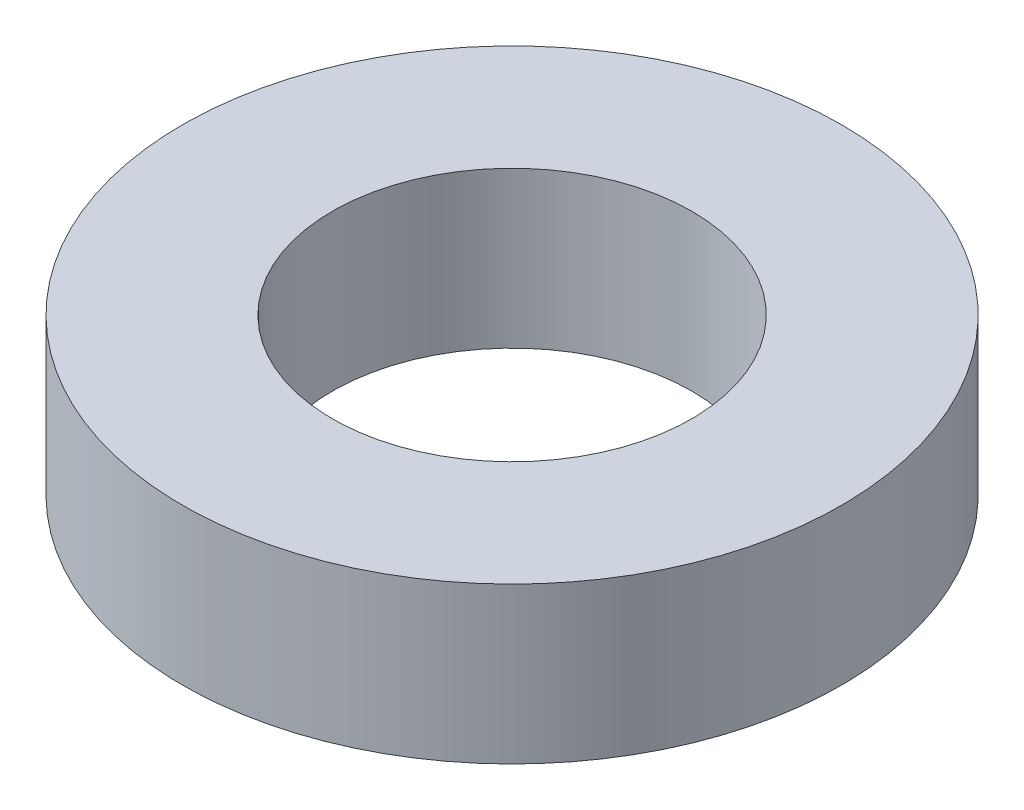
ISO-10303-21;
HEADER;
FILE_DESCRIPTION(('STEP AP214'),'2;1');
FILE_NAME('part.step','',(''),(''),'','','');
FILE_SCHEMA(('AUTOMOTIVE_DESIGN { 1 0 10303 214 1 1 1 1 }'));
ENDSEC;
DATA;
#1=APPLICATION_CONTEXT('core data for automotive mechanical design processes');
#2=APPLICATION_PROTOCOL_DEFINITION('international standard','automotive_design',2000,#1);
#3=PRODUCT_CONTEXT('',#1,'mechanical');
#4=PRODUCT('Part','Part','',(#3));
#5=PRODUCT_RELATED_PRODUCT_CATEGORY('part','',(#4));
#6=PRODUCT_DEFINITION_FORMATION('','',#4);
#7=PRODUCT_DEFINITION_CONTEXT('part definition',#1,'design');
#8=PRODUCT_DEFINITION('design','',#6,#7);
#9=PRODUCT_DEFINITION_SHAPE('','',#8);
#10=(LENGTH_UNIT() NAMED_UNIT(*) SI_UNIT(.MILLI.,.METRE.));
#11=(NAMED_UNIT(*) PLANE_ANGLE_UNIT() SI_UNIT($,.RADIAN.));
#12=(NAMED_UNIT(*) SI_UNIT($,.STERADIAN.) SOLID_ANGLE_UNIT());
#13=UNCERTAINTY_MEASURE_WITH_UNIT(LENGTH_MEASURE(1.E-05),#10,'distance_accuracy_value','');
#14=(GEOMETRIC_REPRESENTATION_CONTEXT(3) GLOBAL_UNCERTAINTY_ASSIGNED_CONTEXT((#13)) GLOBAL_UNIT_ASSIGNED_CONTEXT((#10,
#11,#12)) REPRESENTATION_CONTEXT('',''));
#15=CARTESIAN_POINT('',(0.,0.,0.));
#16=DIRECTION('',(0.,0.,1.));
#17=DIRECTION('',(1.,0.,0.));
#18=AXIS2_PLACEMENT_3D('',#15,#16,#17);
#19=CARTESIAN_POINT('',(0.,13.,0.));
#20=DIRECTION('',(0.,1.,0.));
#21=DIRECTION('',(0.,0.,1.));
#22=AXIS2_PLACEMENT_3D('',#19,#20,#21);
#23=PLANE('',#22);
#24=CARTESIAN_POINT('',(0.,13.,0.));
#25=DIRECTION('',(0.,1.,0.));
#26=DIRECTION('',(0.,0.,1.));
#27=AXIS2_PLACEMENT_3D('',#24,#25,#26);
#28=CIRCLE('',#27,27.5);
#29=CARTESIAN_POINT('',(0.,13.,-27.5));
#30=VERTEX_POINT('',#29);
#31=EDGE_CURVE('E10',#30,#30,#28,.T.);
#32=ORIENTED_EDGE('',*,*,#31,.T.);
#33=EDGE_LOOP('',(#32));
#34=FACE_BOUND('',#33,.T.);
#35=CARTESIAN_POINT('',(0.,13.,0.));
#36=DIRECTION('',(0.,1.,0.));
#37=DIRECTION('',(0.,0.,1.));
#38=AXIS2_PLACEMENT_3D('',#35,#36,#37);
#39=CIRCLE('',#38,15.);
#40=CARTESIAN_POINT('',(0.,13.,-15.));
#41=VERTEX_POINT('',#40);
#42=EDGE_CURVE('E48',#41,#41,#39,.T.);
#43=ORIENTED_EDGE('',*,*,#42,.F.);
#44=EDGE_LOOP('',(#43));
#45=FACE_BOUND('',#44,.T.);
#46=ADVANCED_FACE('F37',(#34,#45),#23,.T.);
#47=CARTESIAN_POINT('',(0.,0.,0.));
#48=DIRECTION('',(0.,1.,0.));
#49=DIRECTION('',(0.,0.,1.));
#50=AXIS2_PLACEMENT_3D('',#47,#48,#49);
#51=PLANE('',#50);
#52=CARTESIAN_POINT('',(0.,0.,0.));
#53=DIRECTION('',(0.,1.,0.));
#54=DIRECTION('',(0.,0.,1.));
#55=AXIS2_PLACEMENT_3D('',#52,#53,#54);
#56=CIRCLE('',#55,27.5);
#57=CARTESIAN_POINT('',(0.,0.,-27.5));
#58=VERTEX_POINT('',#57);
#59=EDGE_CURVE('E41',#58,#58,#56,.T.);
#60=ORIENTED_EDGE('',*,*,#59,.F.);
#61=EDGE_LOOP('',(#60));
#62=FACE_BOUND('',#61,.T.);
#63=CARTESIAN_POINT('',(0.,0.,0.));
#64=DIRECTION('',(0.,1.,0.));
#65=DIRECTION('',(0.,0.,1.));
#66=AXIS2_PLACEMENT_3D('',#63,#64,#65);
#67=CIRCLE('',#66,15.);
#68=CARTESIAN_POINT('',(0.,0.,-15.));
#69=VERTEX_POINT('',#68);
#70=EDGE_CURVE('E50',#69,#69,#67,.T.);
#71=ORIENTED_EDGE('',*,*,#70,.T.);
#72=EDGE_LOOP('',(#71));
#73=FACE_BOUND('',#72,.T.);
#74=ADVANCED_FACE('F60',(#62,#73),#51,.F.);
#75=CARTESIAN_POINT('',(0.,13.,0.));
#76=DIRECTION('',(0.,-1.,0.));
#77=DIRECTION('',(0.,0.,-1.));
#78=AXIS2_PLACEMENT_3D('',#75,#76,#77);
#79=CYLINDRICAL_SURFACE('',#78,27.5);
#80=CARTESIAN_POINT('',(0.,13.,-27.5));
#81=CARTESIAN_POINT('',(0.,12.8645833333333,-27.5));
#82=CARTESIAN_POINT('',(0.,12.7291666666667,-27.5));
#83=CARTESIAN_POINT('',(0.,12.4583333333333,-27.5));
#84=CARTESIAN_POINT('',(0.,12.3229166666667,-27.5));
#85=CARTESIAN_POINT('',(0.,12.0520833333333,-27.5));
#86=CARTESIAN_POINT('',(0.,11.9166666666667,-27.5));
#87=CARTESIAN_POINT('',(0.,11.6458333333333,-27.5));
#88=CARTESIAN_POINT('',(0.,11.5104166666667,-27.5));
#89=CARTESIAN_POINT('',(0.,11.2395833333333,-27.5));
#90=CARTESIAN_POINT('',(0.,11.1041666666667,-27.5));
#91=CARTESIAN_POINT('',(0.,10.8333333333333,-27.5));
#92=CARTESIAN_POINT('',(0.,10.6979166666667,-27.5));
#93=CARTESIAN_POINT('',(0.,10.4270833333333,-27.5));
#94=CARTESIAN_POINT('',(0.,10.2916666666667,-27.5));
#95=CARTESIAN_POINT('',(0.,10.0208333333333,-27.5));
#96=CARTESIAN_POINT('',(0.,9.88541666666667,-27.5));
#97=CARTESIAN_POINT('',(0.,9.61458333333333,-27.5));
#98=CARTESIAN_POINT('',(0.,9.47916666666667,-27.5));
#99=CARTESIAN_POINT('',(0.,9.20833333333333,-27.5));
#100=CARTESIAN_POINT('',(0.,9.07291666666666,-27.5));
#101=CARTESIAN_POINT('',(0.,8.80208333333333,-27.5));
#102=CARTESIAN_POINT('',(0.,8.66666666666667,-27.5));
#103=CARTESIAN_POINT('',(0.,8.39583333333333,-27.5));
#104=CARTESIAN_POINT('',(0.,8.26041666666667,-27.5));
#105=CARTESIAN_POINT('',(0.,7.98958333333333,-27.5));
#106=CARTESIAN_POINT('',(0.,7.85416666666667,-27.5));
#107=CARTESIAN_POINT('',(0.,7.58333333333333,-27.5));
#108=CARTESIAN_POINT('',(0.,7.44791666666667,-27.5));
#109=CARTESIAN_POINT('',(0.,7.17708333333333,-27.5));
#110=CARTESIAN_POINT('',(0.,7.04166666666667,-27.5));
#111=CARTESIAN_POINT('',(0.,6.77083333333333,-27.5));
#112=CARTESIAN_POINT('',(0.,6.63541666666667,-27.5));
#113=CARTESIAN_POINT('',(0.,6.36458333333333,-27.5));
#114=CARTESIAN_POINT('',(0.,6.22916666666667,-27.5));
#115=CARTESIAN_POINT('',(0.,5.95833333333333,-27.5));
#116=CARTESIAN_POINT('',(0.,5.82291666666667,-27.5));
#117=CARTESIAN_POINT('',(0.,5.55208333333333,-27.5));
#118=CARTESIAN_POINT('',(0.,5.41666666666667,-27.5));
#119=CARTESIAN_POINT('',(0.,5.14583333333333,-27.5));
#120=CARTESIAN_POINT('',(0.,5.01041666666667,-27.5));
#121=CARTESIAN_POINT('',(0.,4.73958333333333,-27.5));
#122=CARTESIAN_POINT('',(0.,4.60416666666667,-27.5));
#123=CARTESIAN_POINT('',(0.,4.33333333333333,-27.5));
#124=CARTESIAN_POINT('',(0.,4.19791666666667,-27.5));
#125=CARTESIAN_POINT('',(0.,3.92708333333333,-27.5));
#126=CARTESIAN_POINT('',(0.,3.79166666666667,-27.5));
#127=CARTESIAN_POINT('',(0.,3.52083333333333,-27.5));
#128=CARTESIAN_POINT('',(0.,3.38541666666667,-27.5));
#129=CARTESIAN_POINT('',(0.,3.11458333333333,-27.5));
#130=CARTESIAN_POINT('',(0.,2.97916666666667,-27.5));
#131=CARTESIAN_POINT('',(0.,2.70833333333333,-27.5));
#132=CARTESIAN_POINT('',(0.,2.57291666666667,-27.5));
#133=CARTESIAN_POINT('',(0.,2.30208333333333,-27.5));
#134=CARTESIAN_POINT('',(0.,2.16666666666667,-27.5));
#135=CARTESIAN_POINT('',(0.,1.89583333333333,-27.5));
#136=CARTESIAN_POINT('',(0.,1.76041666666667,-27.5));
#137=CARTESIAN_POINT('',(0.,1.48958333333333,-27.5));
#138=CARTESIAN_POINT('',(0.,1.35416666666667,-27.5));
#139=CARTESIAN_POINT('',(0.,1.08333333333333,-27.5));
#140=CARTESIAN_POINT('',(0.,0.947916666666667,-27.5));
#141=CARTESIAN_POINT('',(0.,0.677083333333334,-27.5));
#142=CARTESIAN_POINT('',(0.,0.541666666666667,-27.5));
#143=CARTESIAN_POINT('',(0.,0.270833333333334,-27.5));
#144=CARTESIAN_POINT('',(0.,0.135416666666667,-27.5));
#145=CARTESIAN_POINT('',(0.,0.,-27.5));
#146=B_SPLINE_CURVE_WITH_KNOTS('',3,(#80,#81,#82,#83,#84,#85,#86,#87,#88,#89,#90,#91,#92,#93,
#94,#95,#96,#97,#98,#99,#100,#101,#102,#103,#104,#105,#106,#107,#108,#109,#110,#111,#112,#113,
#114,#115,#116,#117,#118,#119,#120,#121,#122,#123,#124,#125,#126,#127,#128,#129,#130,#131,#132,
#133,#134,#135,#136,#137,#138,#139,#140,#141,#142,#143,#144,#145),.UNSPECIFIED.,.F.,.F.,(4,2,2,
2,2,2,2,2,2,2,2,2,2,2,2,2,2,2,2,2,2,2,2,2,2,2,2,2,2,2,2,2,4),(0.,0.40625,0.812500000000001,
1.21875,1.625,2.03125,2.4375,2.84375,3.25,3.65625,4.0625,4.46875,4.875,5.28125,5.6875,6.09375,
6.5,6.90625,7.3125,7.71875,8.125,8.53125,8.9375,9.34375,9.75,10.15625,10.5625,10.96875,11.375,
11.78125,12.1875,12.59375,13.),.UNSPECIFIED.);
#147=EDGE_CURVE('BSEAM39',#30,#58,#146,.T.);
#148=ORIENTED_EDGE('',*,*,#31,.F.);
#149=ORIENTED_EDGE('',*,*,#59,.T.);
#150=ORIENTED_EDGE('',*,*,#147,.T.);
#151=ORIENTED_EDGE('',*,*,#147,.F.);
#152=EDGE_LOOP('',(#148,#150,#149,#151));
#153=FACE_BOUND('',#152,.T.);
#154=ADVANCED_FACE('F39',(#153),#79,.T.);
#155=CARTESIAN_POINT('',(0.,13.,0.));
#156=DIRECTION('',(0.,-1.,0.));
#157=DIRECTION('',(0.,0.,-1.));
#158=AXIS2_PLACEMENT_3D('',#155,#156,#157);
#159=CYLINDRICAL_SURFACE('',#158,15.);
#160=CARTESIAN_POINT('',(0.,13.,-15.));
#161=CARTESIAN_POINT('',(0.,12.8645833333333,-15.));
#162=CARTESIAN_POINT('',(0.,12.7291666666667,-15.));
#163=CARTESIAN_POINT('',(0.,12.4583333333333,-15.));
#164=CARTESIAN_POINT('',(0.,12.3229166666667,-15.));
#165=CARTESIAN_POINT('',(0.,12.0520833333333,-15.));
#166=CARTESIAN_POINT('',(0.,11.9166666666667,-15.));
#167=CARTESIAN_POINT('',(0.,11.6458333333333,-15.));
#168=CARTESIAN_POINT('',(0.,11.5104166666667,-15.));
#169=CARTESIAN_POINT('',(0.,11.2395833333333,-15.));
#170=CARTESIAN_POINT('',(0.,11.1041666666667,-15.));
#171=CARTESIAN_POINT('',(0.,10.8333333333333,-15.));
#172=CARTESIAN_POINT('',(0.,10.6979166666667,-15.));
#173=CARTESIAN_POINT('',(0.,10.4270833333333,-15.));
#174=CARTESIAN_POINT('',(0.,10.2916666666667,-15.));
#175=CARTESIAN_POINT('',(0.,10.0208333333333,-15.));
#176=CARTESIAN_POINT('',(0.,9.88541666666667,-15.));
#177=CARTESIAN_POINT('',(0.,9.61458333333333,-15.));
#178=CARTESIAN_POINT('',(0.,9.47916666666667,-15.));
#179=CARTESIAN_POINT('',(0.,9.20833333333333,-15.));
#180=CARTESIAN_POINT('',(0.,9.07291666666666,-15.));
#181=CARTESIAN_POINT('',(0.,8.80208333333333,-15.));
#182=CARTESIAN_POINT('',(0.,8.66666666666667,-15.));
#183=CARTESIAN_POINT('',(0.,8.39583333333333,-15.));
#184=CARTESIAN_POINT('',(0.,8.26041666666667,-15.));
#185=CARTESIAN_POINT('',(0.,7.98958333333333,-15.));
#186=CARTESIAN_POINT('',(0.,7.85416666666667,-15.));
#187=CARTESIAN_POINT('',(0.,7.58333333333333,-15.));
#188=CARTESIAN_POINT('',(0.,7.44791666666667,-15.));
#189=CARTESIAN_POINT('',(0.,7.17708333333333,-15.));
#190=CARTESIAN_POINT('',(0.,7.04166666666667,-15.));
#191=CARTESIAN_POINT('',(0.,6.77083333333333,-15.));
#192=CARTESIAN_POINT('',(0.,6.63541666666667,-15.));
#193=CARTESIAN_POINT('',(0.,6.36458333333333,-15.));
#194=CARTESIAN_POINT('',(0.,6.22916666666667,-15.));
#195=CARTESIAN_POINT('',(0.,5.95833333333333,-15.));
#196=CARTESIAN_POINT('',(0.,5.82291666666667,-15.));
#197=CARTESIAN_POINT('',(0.,5.55208333333333,-15.));
#198=CARTESIAN_POINT('',(0.,5.41666666666667,-15.));
#199=CARTESIAN_POINT('',(0.,5.14583333333333,-15.));
#200=CARTESIAN_POINT('',(0.,5.01041666666667,-15.));
#201=CARTESIAN_POINT('',(0.,4.73958333333333,-15.));
#202=CARTESIAN_POINT('',(0.,4.60416666666667,-15.));
#203=CARTESIAN_POINT('',(0.,4.33333333333333,-15.));
#204=CARTESIAN_POINT('',(0.,4.19791666666667,-15.));
#205=CARTESIAN_POINT('',(0.,3.92708333333333,-15.));
#206=CARTESIAN_POINT('',(0.,3.79166666666667,-15.));
#207=CARTESIAN_POINT('',(0.,3.52083333333333,-15.));
#208=CARTESIAN_POINT('',(0.,3.38541666666667,-15.));
#209=CARTESIAN_POINT('',(0.,3.11458333333333,-15.));
#210=CARTESIAN_POINT('',(0.,2.97916666666667,-15.));
#211=CARTESIAN_POINT('',(0.,2.70833333333333,-15.));
#212=CARTESIAN_POINT('',(0.,2.57291666666667,-15.));
#213=CARTESIAN_POINT('',(0.,2.30208333333333,-15.));
#214=CARTESIAN_POINT('',(0.,2.16666666666667,-15.));
#215=CARTESIAN_POINT('',(0.,1.89583333333333,-15.));
#216=CARTESIAN_POINT('',(0.,1.76041666666667,-15.));
#217=CARTESIAN_POINT('',(0.,1.48958333333333,-15.));
#218=CARTESIAN_POINT('',(0.,1.35416666666667,-15.));
#219=CARTESIAN_POINT('',(0.,1.08333333333333,-15.));
#220=CARTESIAN_POINT('',(0.,0.947916666666667,-15.));
#221=CARTESIAN_POINT('',(0.,0.677083333333334,-15.));
#222=CARTESIAN_POINT('',(0.,0.541666666666667,-15.));
#223=CARTESIAN_POINT('',(0.,0.270833333333334,-15.));
#224=CARTESIAN_POINT('',(0.,0.135416666666667,-15.));
#225=CARTESIAN_POINT('',(0.,0.,-15.));
#226=B_SPLINE_CURVE_WITH_KNOTS('',3,(#160,#161,#162,#163,#164,#165,#166,#167,#168,#169,#170,
#171,#172,#173,#174,#175,#176,#177,#178,#179,#180,#181,#182,#183,#184,#185,#186,#187,#188,#189,
#190,#191,#192,#193,#194,#195,#196,#197,#198,#199,#200,#201,#202,#203,#204,#205,#206,#207,#208,
#209,#210,#211,#212,#213,#214,#215,#216,#217,#218,#219,#220,#221,#222,#223,#224,#225),
.UNSPECIFIED.,.F.,.F.,(4,2,2,2,2,2,2,2,2,2,2,2,2,2,2,2,2,2,2,2,2,2,2,2,2,2,2,2,2,2,2,2,4),(0.,
0.40625,0.812500000000001,1.21875,1.625,2.03125,2.4375,2.84375,3.25,3.65625,4.0625,4.46875,
4.875,5.28125,5.6875,6.09375,6.5,6.90625,7.3125,7.71875,8.125,8.53125,8.9375,9.34375,9.75,
10.15625,10.5625,10.96875,11.375,11.78125,12.1875,12.59375,13.),.UNSPECIFIED.);
#227=EDGE_CURVE('BSEAM56',#41,#69,#226,.T.);
#228=ORIENTED_EDGE('',*,*,#42,.T.);
#229=ORIENTED_EDGE('',*,*,#70,.F.);
#230=ORIENTED_EDGE('',*,*,#227,.T.);
#231=ORIENTED_EDGE('',*,*,#227,.F.);
#232=EDGE_LOOP('',(#228,#230,#229,#231));
#233=FACE_BOUND('',#232,.T.);
#234=ADVANCED_FACE('F56',(#233),#159,.F.);
#235=CLOSED_SHELL('',(#46,#74,#154,#234));
#236=MANIFOLD_SOLID_BREP('B2',#235);
#237=ADVANCED_BREP_SHAPE_REPRESENTATION('',(#18,#236),#14);
#238=SHAPE_DEFINITION_REPRESENTATION(#9,#237);
ENDSEC;
END-ISO-10303-21;
